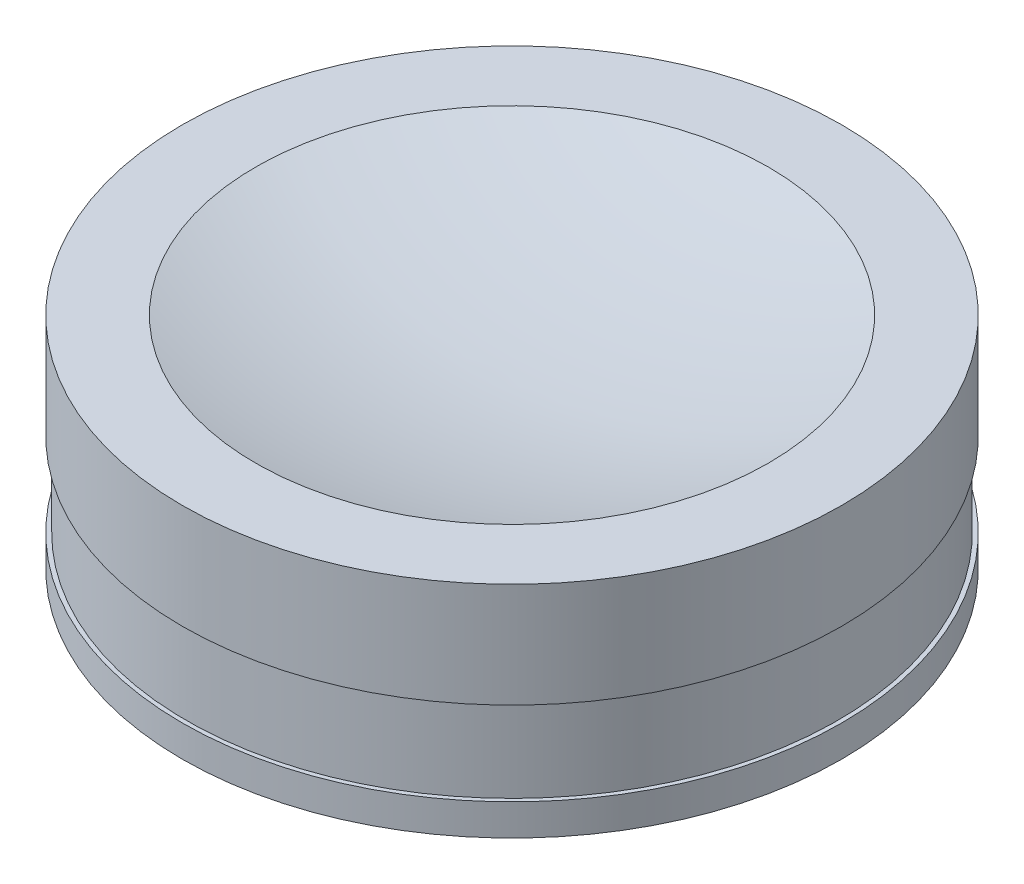
ISO-10303-21;
HEADER;
FILE_DESCRIPTION(('STEP AP214'),'2;1');
FILE_NAME('part.step','',(''),(''),'','','');
FILE_SCHEMA(('AUTOMOTIVE_DESIGN { 1 0 10303 214 1 1 1 1 }'));
ENDSEC;
DATA;
#1=APPLICATION_CONTEXT('core data for automotive mechanical design processes');
#2=APPLICATION_PROTOCOL_DEFINITION('international standard','automotive_design',2000,#1);
#3=PRODUCT_CONTEXT('',#1,'mechanical');
#4=PRODUCT('Part','Part','',(#3));
#5=PRODUCT_RELATED_PRODUCT_CATEGORY('part','',(#4));
#6=PRODUCT_DEFINITION_FORMATION('','',#4);
#7=PRODUCT_DEFINITION_CONTEXT('part definition',#1,'design');
#8=PRODUCT_DEFINITION('design','',#6,#7);
#9=PRODUCT_DEFINITION_SHAPE('','',#8);
#10=(LENGTH_UNIT() NAMED_UNIT(*) SI_UNIT(.MILLI.,.METRE.));
#11=(NAMED_UNIT(*) PLANE_ANGLE_UNIT() SI_UNIT($,.RADIAN.));
#12=(NAMED_UNIT(*) SI_UNIT($,.STERADIAN.) SOLID_ANGLE_UNIT());
#13=UNCERTAINTY_MEASURE_WITH_UNIT(LENGTH_MEASURE(1.E-05),#10,'distance_accuracy_value','');
#14=(GEOMETRIC_REPRESENTATION_CONTEXT(3) GLOBAL_UNCERTAINTY_ASSIGNED_CONTEXT((#13)) GLOBAL_UNIT_ASSIGNED_CONTEXT((#10,
#11,#12)) REPRESENTATION_CONTEXT('',''));
#15=CARTESIAN_POINT('',(0.,0.,0.));
#16=DIRECTION('',(0.,0.,1.));
#17=DIRECTION('',(1.,0.,0.));
#18=AXIS2_PLACEMENT_3D('',#15,#16,#17);
#19=CARTESIAN_POINT('',(0.,191.160526315789,0.));
#20=DIRECTION('',(0.,-1.,0.));
#21=DIRECTION('',(-1.,0.,0.));
#22=AXIS2_PLACEMENT_3D('',#19,#20,#21);
#23=SPHERICAL_SURFACE('',#22,161.760526315789);
#24=CARTESIAN_POINT('',(0.,37.,0.));
#25=DIRECTION('',(0.,-1.,0.));
#26=DIRECTION('',(0.,0.,-1.));
#27=AXIS2_PLACEMENT_3D('',#24,#25,#26);
#28=CIRCLE('',#27,49.);
#29=CARTESIAN_POINT('',(0.,37.,-49.));
#30=VERTEX_POINT('',#29);
#31=EDGE_CURVE('E10',#30,#30,#28,.T.);
#32=ORIENTED_EDGE('',*,*,#31,.T.);
#33=EDGE_LOOP('',(#32));
#34=FACE_BOUND('',#33,.T.);
#35=ADVANCED_FACE('F31',(#34),#23,.T.);
#36=CARTESIAN_POINT('',(58.,37.,0.));
#37=DIRECTION('',(0.,-1.,0.));
#38=DIRECTION('',(0.,0.,-1.));
#39=AXIS2_PLACEMENT_3D('',#36,#37,#38);
#40=PLANE('',#39);
#41=CARTESIAN_POINT('',(0.,37.,0.));
#42=DIRECTION('',(0.,-1.,0.));
#43=DIRECTION('',(0.,0.,-1.));
#44=AXIS2_PLACEMENT_3D('',#41,#42,#43);
#45=CIRCLE('',#44,58.);
#46=CARTESIAN_POINT('',(0.,37.,-58.));
#47=VERTEX_POINT('',#46);
#48=EDGE_CURVE('E37',#47,#47,#45,.T.);
#49=ORIENTED_EDGE('',*,*,#48,.T.);
#50=EDGE_LOOP('',(#49));
#51=FACE_BOUND('',#50,.T.);
#52=ORIENTED_EDGE('',*,*,#31,.F.);
#53=EDGE_LOOP('',(#52));
#54=FACE_BOUND('',#53,.T.);
#55=ADVANCED_FACE('F93',(#51,#54),#40,.T.);
#56=CARTESIAN_POINT('',(0.,0.,0.));
#57=DIRECTION('',(0.,-1.,0.));
#58=DIRECTION('',(0.,0.,-1.));
#59=AXIS2_PLACEMENT_3D('',#56,#57,#58);
#60=CYLINDRICAL_SURFACE('',#59,58.);
#61=CARTESIAN_POINT('',(0.,15.5,0.));
#62=DIRECTION('',(0.,-1.,0.));
#63=DIRECTION('',(0.,0.,-1.));
#64=AXIS2_PLACEMENT_3D('',#61,#62,#63);
#65=CIRCLE('',#64,58.);
#66=CARTESIAN_POINT('',(0.,15.5,-58.));
#67=VERTEX_POINT('',#66);
#68=EDGE_CURVE('E41',#67,#67,#65,.T.);
#69=ORIENTED_EDGE('',*,*,#68,.T.);
#70=EDGE_LOOP('',(#69));
#71=FACE_BOUND('',#70,.T.);
#72=ORIENTED_EDGE('',*,*,#48,.F.);
#73=EDGE_LOOP('',(#72));
#74=FACE_BOUND('',#73,.T.);
#75=ADVANCED_FACE('F97',(#71,#74),#60,.F.);
#76=CARTESIAN_POINT('',(0.,14.,0.));
#77=DIRECTION('',(0.,-1.,0.));
#78=DIRECTION('',(0.,0.,-1.));
#79=AXIS2_PLACEMENT_3D('',#76,#77,#78);
#80=TOROIDAL_SURFACE('',#79,58.,1.5);
#81=CARTESIAN_POINT('',(0.,12.5,0.));
#82=DIRECTION('',(0.,-1.,0.));
#83=DIRECTION('',(0.,0.,-1.));
#84=AXIS2_PLACEMENT_3D('',#81,#82,#83);
#85=CIRCLE('',#84,58.);
#86=CARTESIAN_POINT('',(0.,12.5,-58.));
#87=VERTEX_POINT('',#86);
#88=EDGE_CURVE('E45',#87,#87,#85,.T.);
#89=ORIENTED_EDGE('',*,*,#88,.T.);
#90=EDGE_LOOP('',(#89));
#91=FACE_BOUND('',#90,.T.);
#92=ORIENTED_EDGE('',*,*,#68,.F.);
#93=EDGE_LOOP('',(#92));
#94=FACE_BOUND('',#93,.T.);
#95=ADVANCED_FACE('F101',(#91,#94),#80,.T.);
#96=CARTESIAN_POINT('',(0.,0.,0.));
#97=DIRECTION('',(0.,-1.,0.));
#98=DIRECTION('',(0.,0.,-1.));
#99=AXIS2_PLACEMENT_3D('',#96,#97,#98);
#100=CYLINDRICAL_SURFACE('',#99,58.);
#101=CARTESIAN_POINT('',(0.,9.5,0.));
#102=DIRECTION('',(0.,-1.,0.));
#103=DIRECTION('',(0.,0.,-1.));
#104=AXIS2_PLACEMENT_3D('',#101,#102,#103);
#105=CIRCLE('',#104,58.);
#106=CARTESIAN_POINT('',(0.,9.5,-58.));
#107=VERTEX_POINT('',#106);
#108=EDGE_CURVE('E50',#107,#107,#105,.T.);
#109=ORIENTED_EDGE('',*,*,#108,.T.);
#110=EDGE_LOOP('',(#109));
#111=FACE_BOUND('',#110,.T.);
#112=ORIENTED_EDGE('',*,*,#88,.F.);
#113=EDGE_LOOP('',(#112));
#114=FACE_BOUND('',#113,.T.);
#115=ADVANCED_FACE('F108',(#111,#114),#100,.F.);
#116=CARTESIAN_POINT('',(0.,8.,0.));
#117=DIRECTION('',(0.,-1.,0.));
#118=DIRECTION('',(0.,0.,-1.));
#119=AXIS2_PLACEMENT_3D('',#116,#117,#118);
#120=TOROIDAL_SURFACE('',#119,58.,1.5);
#121=CARTESIAN_POINT('',(0.,6.5,0.));
#122=DIRECTION('',(0.,-1.,0.));
#123=DIRECTION('',(0.,0.,-1.));
#124=AXIS2_PLACEMENT_3D('',#121,#122,#123);
#125=CIRCLE('',#124,58.);
#126=CARTESIAN_POINT('',(0.,6.5,-58.));
#127=VERTEX_POINT('',#126);
#128=EDGE_CURVE('E53',#127,#127,#125,.T.);
#129=ORIENTED_EDGE('',*,*,#128,.T.);
#130=EDGE_LOOP('',(#129));
#131=FACE_BOUND('',#130,.T.);
#132=ORIENTED_EDGE('',*,*,#108,.F.);
#133=EDGE_LOOP('',(#132));
#134=FACE_BOUND('',#133,.T.);
#135=ADVANCED_FACE('F112',(#131,#134),#120,.T.);
#136=CARTESIAN_POINT('',(0.,0.,0.));
#137=DIRECTION('',(0.,-1.,0.));
#138=DIRECTION('',(0.,0.,-1.));
#139=AXIS2_PLACEMENT_3D('',#136,#137,#138);
#140=CYLINDRICAL_SURFACE('',#139,58.);
#141=CARTESIAN_POINT('',(0.,0.,0.));
#142=DIRECTION('',(0.,-1.,0.));
#143=DIRECTION('',(0.,0.,-1.));
#144=AXIS2_PLACEMENT_3D('',#141,#142,#143);
#145=CIRCLE('',#144,58.);
#146=CARTESIAN_POINT('',(0.,0.,-58.));
#147=VERTEX_POINT('',#146);
#148=EDGE_CURVE('E56',#147,#147,#145,.T.);
#149=ORIENTED_EDGE('',*,*,#148,.T.);
#150=EDGE_LOOP('',(#149));
#151=FACE_BOUND('',#150,.T.);
#152=ORIENTED_EDGE('',*,*,#128,.F.);
#153=EDGE_LOOP('',(#152));
#154=FACE_BOUND('',#153,.T.);
#155=ADVANCED_FACE('F116',(#151,#154),#140,.F.);
#156=CARTESIAN_POINT('',(63.,0.,0.));
#157=DIRECTION('',(0.,-1.,0.));
#158=DIRECTION('',(0.,0.,-1.));
#159=AXIS2_PLACEMENT_3D('',#156,#157,#158);
#160=PLANE('',#159);
#161=CARTESIAN_POINT('',(0.,0.,0.));
#162=DIRECTION('',(0.,-1.,0.));
#163=DIRECTION('',(0.,0.,-1.));
#164=AXIS2_PLACEMENT_3D('',#161,#162,#163);
#165=CIRCLE('',#164,63.);
#166=CARTESIAN_POINT('',(0.,0.,-63.));
#167=VERTEX_POINT('',#166);
#168=EDGE_CURVE('E59',#167,#167,#165,.T.);
#169=ORIENTED_EDGE('',*,*,#168,.T.);
#170=EDGE_LOOP('',(#169));
#171=FACE_BOUND('',#170,.T.);
#172=ORIENTED_EDGE('',*,*,#148,.F.);
#173=EDGE_LOOP('',(#172));
#174=FACE_BOUND('',#173,.T.);
#175=ADVANCED_FACE('F120',(#171,#174),#160,.T.);
#176=CARTESIAN_POINT('',(0.,0.,0.));
#177=DIRECTION('',(0.,-1.,0.));
#178=DIRECTION('',(0.,0.,-1.));
#179=AXIS2_PLACEMENT_3D('',#176,#177,#178);
#180=CYLINDRICAL_SURFACE('',#179,63.);
#181=CARTESIAN_POINT('',(0.,6.,0.));
#182=DIRECTION('',(0.,-1.,0.));
#183=DIRECTION('',(0.,0.,-1.));
#184=AXIS2_PLACEMENT_3D('',#181,#182,#183);
#185=CIRCLE('',#184,63.);
#186=CARTESIAN_POINT('',(0.,6.,-63.));
#187=VERTEX_POINT('',#186);
#188=EDGE_CURVE('E62',#187,#187,#185,.T.);
#189=ORIENTED_EDGE('',*,*,#188,.T.);
#190=EDGE_LOOP('',(#189));
#191=FACE_BOUND('',#190,.T.);
#192=ORIENTED_EDGE('',*,*,#168,.F.);
#193=EDGE_LOOP('',(#192));
#194=FACE_BOUND('',#193,.T.);
#195=ADVANCED_FACE('F124',(#191,#194),#180,.T.);
#196=CARTESIAN_POINT('',(62.2,6.,0.));
#197=DIRECTION('',(0.,1.,0.));
#198=DIRECTION('',(0.,0.,1.));
#199=AXIS2_PLACEMENT_3D('',#196,#197,#198);
#200=PLANE('',#199);
#201=CARTESIAN_POINT('',(0.,6.,0.));
#202=DIRECTION('',(0.,-1.,0.));
#203=DIRECTION('',(0.,0.,-1.));
#204=AXIS2_PLACEMENT_3D('',#201,#202,#203);
#205=CIRCLE('',#204,62.2);
#206=CARTESIAN_POINT('',(0.,6.,-62.2));
#207=VERTEX_POINT('',#206);
#208=EDGE_CURVE('E65',#207,#207,#205,.T.);
#209=ORIENTED_EDGE('',*,*,#208,.T.);
#210=EDGE_LOOP('',(#209));
#211=FACE_BOUND('',#210,.T.);
#212=ORIENTED_EDGE('',*,*,#188,.F.);
#213=EDGE_LOOP('',(#212));
#214=FACE_BOUND('',#213,.T.);
#215=ADVANCED_FACE('F128',(#211,#214),#200,.T.);
#216=CARTESIAN_POINT('',(0.,0.,0.));
#217=DIRECTION('',(0.,-1.,0.));
#218=DIRECTION('',(0.,0.,-1.));
#219=AXIS2_PLACEMENT_3D('',#216,#217,#218);
#220=CYLINDRICAL_SURFACE('',#219,62.2);
#221=CARTESIAN_POINT('',(0.,22.,0.));
#222=DIRECTION('',(0.,-1.,0.));
#223=DIRECTION('',(0.,0.,-1.));
#224=AXIS2_PLACEMENT_3D('',#221,#222,#223);
#225=CIRCLE('',#224,62.2);
#226=CARTESIAN_POINT('',(0.,22.,-62.2));
#227=VERTEX_POINT('',#226);
#228=EDGE_CURVE('E68',#227,#227,#225,.T.);
#229=ORIENTED_EDGE('',*,*,#228,.T.);
#230=EDGE_LOOP('',(#229));
#231=FACE_BOUND('',#230,.T.);
#232=ORIENTED_EDGE('',*,*,#208,.F.);
#233=EDGE_LOOP('',(#232));
#234=FACE_BOUND('',#233,.T.);
#235=ADVANCED_FACE('F132',(#231,#234),#220,.T.);
#236=CARTESIAN_POINT('',(63.,22.,0.));
#237=DIRECTION('',(0.,-1.,0.));
#238=DIRECTION('',(0.,0.,-1.));
#239=AXIS2_PLACEMENT_3D('',#236,#237,#238);
#240=PLANE('',#239);
#241=CARTESIAN_POINT('',(0.,22.,0.));
#242=DIRECTION('',(0.,-1.,0.));
#243=DIRECTION('',(0.,0.,-1.));
#244=AXIS2_PLACEMENT_3D('',#241,#242,#243);
#245=CIRCLE('',#244,63.);
#246=CARTESIAN_POINT('',(0.,22.,-63.));
#247=VERTEX_POINT('',#246);
#248=EDGE_CURVE('E71',#247,#247,#245,.T.);
#249=ORIENTED_EDGE('',*,*,#248,.T.);
#250=EDGE_LOOP('',(#249));
#251=FACE_BOUND('',#250,.T.);
#252=ORIENTED_EDGE('',*,*,#228,.F.);
#253=EDGE_LOOP('',(#252));
#254=FACE_BOUND('',#253,.T.);
#255=ADVANCED_FACE('F136',(#251,#254),#240,.T.);
#256=CARTESIAN_POINT('',(0.,0.,0.));
#257=DIRECTION('',(0.,-1.,0.));
#258=DIRECTION('',(0.,0.,-1.));
#259=AXIS2_PLACEMENT_3D('',#256,#257,#258);
#260=CYLINDRICAL_SURFACE('',#259,63.);
#261=CARTESIAN_POINT('',(0.,42.,0.));
#262=DIRECTION('',(0.,-1.,0.));
#263=DIRECTION('',(0.,0.,-1.));
#264=AXIS2_PLACEMENT_3D('',#261,#262,#263);
#265=CIRCLE('',#264,63.);
#266=CARTESIAN_POINT('',(0.,42.,-63.));
#267=VERTEX_POINT('',#266);
#268=EDGE_CURVE('E74',#267,#267,#265,.T.);
#269=ORIENTED_EDGE('',*,*,#268,.T.);
#270=EDGE_LOOP('',(#269));
#271=FACE_BOUND('',#270,.T.);
#272=ORIENTED_EDGE('',*,*,#248,.F.);
#273=EDGE_LOOP('',(#272));
#274=FACE_BOUND('',#273,.T.);
#275=ADVANCED_FACE('F90',(#271,#274),#260,.T.);
#276=CARTESIAN_POINT('',(49.,42.,0.));
#277=DIRECTION('',(0.,1.,0.));
#278=DIRECTION('',(0.,0.,1.));
#279=AXIS2_PLACEMENT_3D('',#276,#277,#278);
#280=PLANE('',#279);
#281=CARTESIAN_POINT('',(0.,42.,0.));
#282=DIRECTION('',(0.,-1.,0.));
#283=DIRECTION('',(0.,0.,-1.));
#284=AXIS2_PLACEMENT_3D('',#281,#282,#283);
#285=CIRCLE('',#284,48.9999999999999);
#286=CARTESIAN_POINT('',(0.,42.,-48.9999999999999));
#287=VERTEX_POINT('',#286);
#288=EDGE_CURVE('E77',#287,#287,#285,.T.);
#289=ORIENTED_EDGE('',*,*,#288,.T.);
#290=EDGE_LOOP('',(#289));
#291=FACE_BOUND('',#290,.T.);
#292=ORIENTED_EDGE('',*,*,#268,.F.);
#293=EDGE_LOOP('',(#292));
#294=FACE_BOUND('',#293,.T.);
#295=ADVANCED_FACE('F81',(#291,#294),#280,.T.);
#296=CARTESIAN_POINT('',(0.,196.16052631579,0.));
#297=DIRECTION('',(0.,-1.,0.));
#298=DIRECTION('',(1.,0.,0.));
#299=AXIS2_PLACEMENT_3D('',#296,#297,#298);
#300=SPHERICAL_SURFACE('',#299,161.76052631579);
#301=ORIENTED_EDGE('',*,*,#288,.F.);
#302=EDGE_LOOP('',(#301));
#303=FACE_BOUND('',#302,.T.);
#304=ADVANCED_FACE('F84',(#303),#300,.F.);
#305=CLOSED_SHELL('',(#35,#55,#75,#95,#115,#135,#155,#175,#195,#215,#235,#255,#275,#295,#304));
#306=MANIFOLD_SOLID_BREP('B2',#305);
#307=ADVANCED_BREP_SHAPE_REPRESENTATION('',(#18,#306),#14);
#308=SHAPE_DEFINITION_REPRESENTATION(#9,#307);
ENDSEC;
END-ISO-10303-21;
